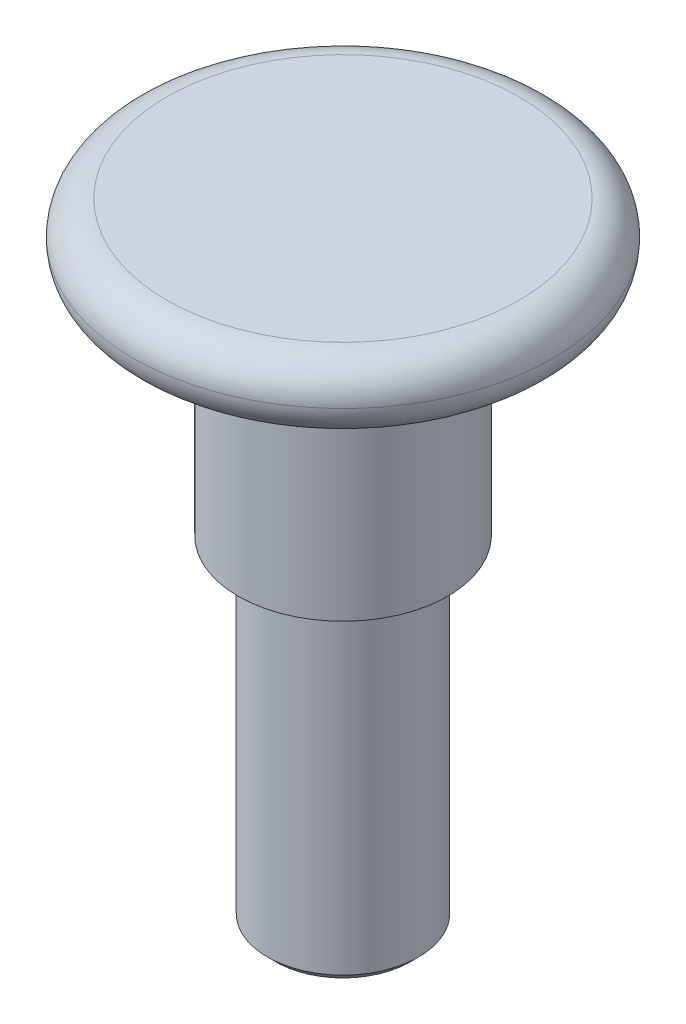
ISO-10303-21;
HEADER;
FILE_DESCRIPTION(('STEP AP214'),'2;1');
FILE_NAME('part.step','',(''),(''),'','','');
FILE_SCHEMA(('AUTOMOTIVE_DESIGN { 1 0 10303 214 1 1 1 1 }'));
ENDSEC;
DATA;
#1=APPLICATION_CONTEXT('core data for automotive mechanical design processes');
#2=APPLICATION_PROTOCOL_DEFINITION('international standard','automotive_design',2000,#1);
#3=PRODUCT_CONTEXT('',#1,'mechanical');
#4=PRODUCT('Part','Part','',(#3));
#5=PRODUCT_RELATED_PRODUCT_CATEGORY('part','',(#4));
#6=PRODUCT_DEFINITION_FORMATION('','',#4);
#7=PRODUCT_DEFINITION_CONTEXT('part definition',#1,'design');
#8=PRODUCT_DEFINITION('design','',#6,#7);
#9=PRODUCT_DEFINITION_SHAPE('','',#8);
#10=(LENGTH_UNIT() NAMED_UNIT(*) SI_UNIT(.MILLI.,.METRE.));
#11=(NAMED_UNIT(*) PLANE_ANGLE_UNIT() SI_UNIT($,.RADIAN.));
#12=(NAMED_UNIT(*) SI_UNIT($,.STERADIAN.) SOLID_ANGLE_UNIT());
#13=UNCERTAINTY_MEASURE_WITH_UNIT(LENGTH_MEASURE(1.E-05),#10,'distance_accuracy_value','');
#14=(GEOMETRIC_REPRESENTATION_CONTEXT(3) GLOBAL_UNCERTAINTY_ASSIGNED_CONTEXT((#13)) GLOBAL_UNIT_ASSIGNED_CONTEXT((#10,
#11,#12)) REPRESENTATION_CONTEXT('',''));
#15=CARTESIAN_POINT('',(0.,0.,0.));
#16=DIRECTION('',(0.,0.,1.));
#17=DIRECTION('',(1.,0.,0.));
#18=AXIS2_PLACEMENT_3D('',#15,#16,#17);
#19=CARTESIAN_POINT('',(0.,56.5452380952381,0.));
#20=DIRECTION('',(0.,1.,0.));
#21=DIRECTION('',(0.,0.,1.));
#22=AXIS2_PLACEMENT_3D('',#19,#20,#21);
#23=PLANE('',#22);
#24=CARTESIAN_POINT('',(0.,56.5452380952381,0.));
#25=DIRECTION('',(0.,1.,0.));
#26=DIRECTION('',(0.,0.,1.));
#27=AXIS2_PLACEMENT_3D('',#24,#25,#26);
#28=CIRCLE('',#27,10.5);
#29=CARTESIAN_POINT('',(0.,56.5452380952381,10.5));
#30=VERTEX_POINT('',#29);
#31=EDGE_CURVE('E42',#30,#30,#28,.T.);
#32=ORIENTED_EDGE('',*,*,#31,.T.);
#33=EDGE_LOOP('',(#32));
#34=FACE_BOUND('',#33,.T.);
#35=ADVANCED_FACE('F31',(#34),#23,.T.);
#36=CARTESIAN_POINT('',(12.5,52.5452380952381,0.));
#37=DIRECTION('',(0.,-1.,0.));
#38=DIRECTION('',(0.,0.,-1.));
#39=AXIS2_PLACEMENT_3D('',#36,#37,#38);
#40=PLANE('',#39);
#41=CARTESIAN_POINT('',(0.,52.5452380952381,0.));
#42=DIRECTION('',(0.,-1.,0.));
#43=DIRECTION('',(0.,0.,-1.));
#44=AXIS2_PLACEMENT_3D('',#41,#42,#43);
#45=CIRCLE('',#44,10.5);
#46=CARTESIAN_POINT('',(0.,52.5452380952381,-10.5));
#47=VERTEX_POINT('',#46);
#48=EDGE_CURVE('E46',#47,#47,#45,.T.);
#49=ORIENTED_EDGE('',*,*,#48,.T.);
#50=EDGE_LOOP('',(#49));
#51=FACE_BOUND('',#50,.T.);
#52=CARTESIAN_POINT('',(0.,52.5452380952381,0.));
#53=DIRECTION('',(0.,-1.,0.));
#54=DIRECTION('',(0.,0.,-1.));
#55=AXIS2_PLACEMENT_3D('',#52,#53,#54);
#56=CIRCLE('',#55,6.25);
#57=CARTESIAN_POINT('',(0.,52.5452380952381,-6.25));
#58=VERTEX_POINT('',#57);
#59=EDGE_CURVE('E55',#58,#58,#56,.T.);
#60=ORIENTED_EDGE('',*,*,#59,.F.);
#61=EDGE_LOOP('',(#60));
#62=FACE_BOUND('',#61,.T.);
#63=ADVANCED_FACE('F77',(#51,#62),#40,.T.);
#64=CARTESIAN_POINT('',(0.,-62.7616279069767,0.));
#65=DIRECTION('',(0.,-1.,0.));
#66=DIRECTION('',(0.,0.,-1.));
#67=AXIS2_PLACEMENT_3D('',#64,#65,#66);
#68=CYLINDRICAL_SURFACE('',#67,6.25);
#69=ORIENTED_EDGE('',*,*,#59,.T.);
#70=EDGE_LOOP('',(#69));
#71=FACE_BOUND('',#70,.T.);
#72=CARTESIAN_POINT('',(0.,39.1452380952381,0.));
#73=DIRECTION('',(0.,-1.,0.));
#74=DIRECTION('',(0.,0.,-1.));
#75=AXIS2_PLACEMENT_3D('',#72,#73,#74);
#76=CIRCLE('',#75,6.25);
#77=CARTESIAN_POINT('',(0.,39.1452380952381,-6.25));
#78=VERTEX_POINT('',#77);
#79=EDGE_CURVE('E58',#78,#78,#76,.T.);
#80=ORIENTED_EDGE('',*,*,#79,.F.);
#81=EDGE_LOOP('',(#80));
#82=FACE_BOUND('',#81,.T.);
#83=ADVANCED_FACE('F68',(#71,#82),#68,.T.);
#84=CARTESIAN_POINT('',(6.25,39.1452380952381,0.));
#85=DIRECTION('',(0.,-1.,0.));
#86=DIRECTION('',(0.,0.,-1.));
#87=AXIS2_PLACEMENT_3D('',#84,#85,#86);
#88=PLANE('',#87);
#89=ORIENTED_EDGE('',*,*,#79,.T.);
#90=EDGE_LOOP('',(#89));
#91=FACE_BOUND('',#90,.T.);
#92=CARTESIAN_POINT('',(0.,39.1452380952381,0.));
#93=DIRECTION('',(0.,-1.,0.));
#94=DIRECTION('',(0.,0.,-1.));
#95=AXIS2_PLACEMENT_3D('',#92,#93,#94);
#96=CIRCLE('',#95,4.5);
#97=CARTESIAN_POINT('',(0.,39.1452380952381,-4.5));
#98=VERTEX_POINT('',#97);
#99=EDGE_CURVE('E51',#98,#98,#96,.T.);
#100=ORIENTED_EDGE('',*,*,#99,.F.);
#101=EDGE_LOOP('',(#100));
#102=FACE_BOUND('',#101,.T.);
#103=ADVANCED_FACE('F66',(#91,#102),#88,.T.);
#104=CARTESIAN_POINT('',(0.,-62.7616279069767,0.));
#105=DIRECTION('',(0.,-1.,0.));
#106=DIRECTION('',(0.,0.,-1.));
#107=AXIS2_PLACEMENT_3D('',#104,#105,#106);
#108=CYLINDRICAL_SURFACE('',#107,4.5);
#109=CARTESIAN_POINT('',(0.,19.6452380952381,0.));
#110=DIRECTION('',(0.,-1.,0.));
#111=DIRECTION('',(0.,0.,-1.));
#112=AXIS2_PLACEMENT_3D('',#109,#110,#111);
#113=CIRCLE('',#112,4.5);
#114=CARTESIAN_POINT('',(0.,19.6452380952381,-4.5));
#115=VERTEX_POINT('',#114);
#116=EDGE_CURVE('E10',#115,#115,#113,.F.);
#117=ORIENTED_EDGE('',*,*,#116,.T.);
#118=EDGE_LOOP('',(#117));
#119=FACE_BOUND('',#118,.T.);
#120=ORIENTED_EDGE('',*,*,#99,.T.);
#121=EDGE_LOOP('',(#120));
#122=FACE_BOUND('',#121,.T.);
#123=ADVANCED_FACE('F64',(#119,#122),#108,.T.);
#124=CARTESIAN_POINT('',(4.5,19.1452380952381,0.));
#125=DIRECTION('',(0.,-1.,0.));
#126=DIRECTION('',(0.,0.,-1.));
#127=AXIS2_PLACEMENT_3D('',#124,#125,#126);
#128=PLANE('',#127);
#129=CARTESIAN_POINT('',(0.,19.1452380952381,0.));
#130=DIRECTION('',(0.,-1.,0.));
#131=DIRECTION('',(0.,0.,-1.));
#132=AXIS2_PLACEMENT_3D('',#129,#130,#131);
#133=CIRCLE('',#132,4.);
#134=CARTESIAN_POINT('',(0.,19.1452380952381,-4.));
#135=VERTEX_POINT('',#134);
#136=EDGE_CURVE('E38',#135,#135,#133,.T.);
#137=ORIENTED_EDGE('',*,*,#136,.T.);
#138=EDGE_LOOP('',(#137));
#139=FACE_BOUND('',#138,.T.);
#140=ADVANCED_FACE('F75',(#139),#128,.T.);
#141=CARTESIAN_POINT('',(0.,54.5452380952381,0.));
#142=DIRECTION('',(0.,1.,0.));
#143=DIRECTION('',(0.,0.,1.));
#144=AXIS2_PLACEMENT_3D('',#141,#142,#143);
#145=TOROIDAL_SURFACE('',#144,10.5,2.);
#146=ORIENTED_EDGE('',*,*,#31,.F.);
#147=EDGE_LOOP('',(#146));
#148=FACE_BOUND('',#147,.T.);
#149=CARTESIAN_POINT('',(0.,54.5452380952381,0.));
#150=DIRECTION('',(0.,1.,0.));
#151=DIRECTION('',(0.,0.,1.));
#152=AXIS2_PLACEMENT_3D('',#149,#150,#151);
#153=CIRCLE('',#152,12.5);
#154=CARTESIAN_POINT('',(0.,54.5452380952381,12.5));
#155=VERTEX_POINT('',#154);
#156=EDGE_CURVE('E49',#155,#155,#153,.F.);
#157=ORIENTED_EDGE('',*,*,#156,.F.);
#158=EDGE_LOOP('',(#157));
#159=FACE_BOUND('',#158,.T.);
#160=ADVANCED_FACE('F91',(#148,#159),#145,.T.);
#161=CARTESIAN_POINT('',(0.,54.5452380952381,0.));
#162=DIRECTION('',(0.,-1.,0.));
#163=DIRECTION('',(0.,0.,-1.));
#164=AXIS2_PLACEMENT_3D('',#161,#162,#163);
#165=TOROIDAL_SURFACE('',#164,10.5,2.);
#166=ORIENTED_EDGE('',*,*,#156,.T.);
#167=EDGE_LOOP('',(#166));
#168=FACE_BOUND('',#167,.T.);
#169=ORIENTED_EDGE('',*,*,#48,.F.);
#170=EDGE_LOOP('',(#169));
#171=FACE_BOUND('',#170,.T.);
#172=ADVANCED_FACE('F89',(#168,#171),#165,.T.);
#173=CARTESIAN_POINT('',(0.,19.1452380952381,0.));
#174=DIRECTION('',(0.,1.,0.));
#175=DIRECTION('',(0.,0.,1.));
#176=AXIS2_PLACEMENT_3D('',#173,#174,#175);
#177=CONICAL_SURFACE('',#176,4.,0.785398163397443);
#178=ORIENTED_EDGE('',*,*,#116,.F.);
#179=EDGE_LOOP('',(#178));
#180=FACE_BOUND('',#179,.T.);
#181=ORIENTED_EDGE('',*,*,#136,.F.);
#182=EDGE_LOOP('',(#181));
#183=FACE_BOUND('',#182,.T.);
#184=ADVANCED_FACE('F33',(#180,#183),#177,.T.);
#185=CLOSED_SHELL('',(#35,#63,#83,#103,#123,#140,#160,#172,#184));
#186=MANIFOLD_SOLID_BREP('B2',#185);
#187=ADVANCED_BREP_SHAPE_REPRESENTATION('',(#18,#186),#14);
#188=SHAPE_DEFINITION_REPRESENTATION(#9,#187);
ENDSEC;
END-ISO-10303-21;
